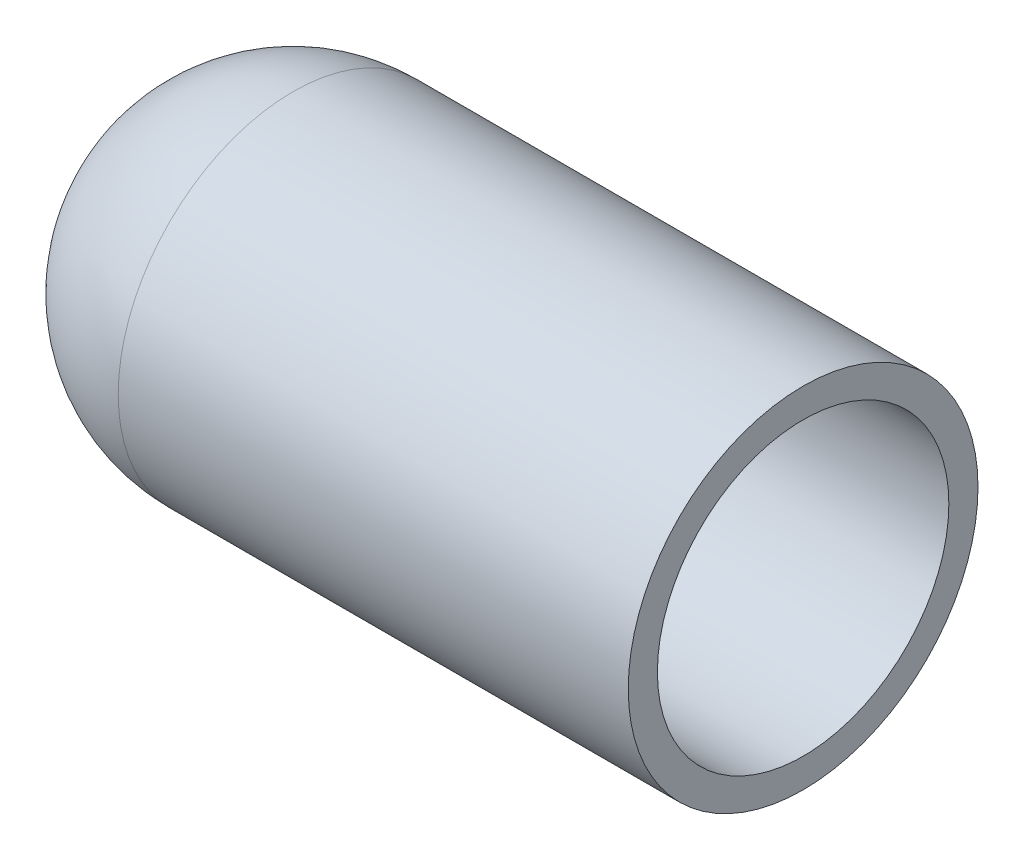
ISO-10303-21;
HEADER;
FILE_DESCRIPTION(('STEP AP214'),'2;1');
FILE_NAME('part.step','',(''),(''),'','','');
FILE_SCHEMA(('AUTOMOTIVE_DESIGN { 1 0 10303 214 1 1 1 1 }'));
ENDSEC;
DATA;
#1=APPLICATION_CONTEXT('core data for automotive mechanical design processes');
#2=APPLICATION_PROTOCOL_DEFINITION('international standard','automotive_design',2000,#1);
#3=PRODUCT_CONTEXT('',#1,'mechanical');
#4=PRODUCT('Part','Part','',(#3));
#5=PRODUCT_RELATED_PRODUCT_CATEGORY('part','',(#4));
#6=PRODUCT_DEFINITION_FORMATION('','',#4);
#7=PRODUCT_DEFINITION_CONTEXT('part definition',#1,'design');
#8=PRODUCT_DEFINITION('design','',#6,#7);
#9=PRODUCT_DEFINITION_SHAPE('','',#8);
#10=(LENGTH_UNIT() NAMED_UNIT(*) SI_UNIT(.MILLI.,.METRE.));
#11=(NAMED_UNIT(*) PLANE_ANGLE_UNIT() SI_UNIT($,.RADIAN.));
#12=(NAMED_UNIT(*) SI_UNIT($,.STERADIAN.) SOLID_ANGLE_UNIT());
#13=UNCERTAINTY_MEASURE_WITH_UNIT(LENGTH_MEASURE(1.E-05),#10,'distance_accuracy_value','');
#14=(GEOMETRIC_REPRESENTATION_CONTEXT(3) GLOBAL_UNCERTAINTY_ASSIGNED_CONTEXT((#13)) GLOBAL_UNIT_ASSIGNED_CONTEXT((#10,
#11,#12)) REPRESENTATION_CONTEXT('',''));
#15=CARTESIAN_POINT('',(0.,0.,0.));
#16=DIRECTION('',(0.,0.,1.));
#17=DIRECTION('',(1.,0.,0.));
#18=AXIS2_PLACEMENT_3D('',#15,#16,#17);
#19=CARTESIAN_POINT('',(18.8400471736981,0.,-12.));
#20=DIRECTION('',(1.,0.,0.));
#21=DIRECTION('',(0.,0.,-1.));
#22=AXIS2_PLACEMENT_3D('',#19,#20,#21);
#23=PLANE('',#22);
#24=CARTESIAN_POINT('',(18.8400471736981,0.,0.));
#25=DIRECTION('',(1.,0.,0.));
#26=DIRECTION('',(0.,0.,-1.));
#27=AXIS2_PLACEMENT_3D('',#24,#25,#26);
#28=CIRCLE('',#27,10.);
#29=CARTESIAN_POINT('',(18.8400471736981,0.,-10.));
#30=VERTEX_POINT('',#29);
#31=EDGE_CURVE('E41',#30,#30,#28,.F.);
#32=ORIENTED_EDGE('',*,*,#31,.T.);
#33=EDGE_LOOP('',(#32));
#34=FACE_BOUND('',#33,.T.);
#35=CARTESIAN_POINT('',(18.8400471736981,0.,0.));
#36=DIRECTION('',(-1.,0.,0.));
#37=DIRECTION('',(0.,0.,1.));
#38=AXIS2_PLACEMENT_3D('',#35,#36,#37);
#39=CIRCLE('',#38,12.);
#40=CARTESIAN_POINT('',(18.8400471736981,0.,12.));
#41=VERTEX_POINT('',#40);
#42=EDGE_CURVE('E10',#41,#41,#39,.T.);
#43=ORIENTED_EDGE('',*,*,#42,.F.);
#44=EDGE_LOOP('',(#43));
#45=FACE_BOUND('',#44,.T.);
#46=ADVANCED_FACE('F31',(#34,#45),#23,.T.);
#47=CARTESIAN_POINT('',(-16.1599528263019,0.,0.));
#48=DIRECTION('',(-1.,0.,0.));
#49=DIRECTION('',(0.,0.,1.));
#50=AXIS2_PLACEMENT_3D('',#47,#48,#49);
#51=CYLINDRICAL_SURFACE('',#50,12.);
#52=ORIENTED_EDGE('',*,*,#42,.T.);
#53=EDGE_LOOP('',(#52));
#54=FACE_BOUND('',#53,.T.);
#55=CARTESIAN_POINT('',(-16.1599528263019,0.,0.));
#56=DIRECTION('',(-1.,0.,0.));
#57=DIRECTION('',(0.,0.,1.));
#58=AXIS2_PLACEMENT_3D('',#55,#56,#57);
#59=CIRCLE('',#58,12.);
#60=CARTESIAN_POINT('',(-16.1599528263019,0.,12.));
#61=VERTEX_POINT('',#60);
#62=EDGE_CURVE('E37',#61,#61,#59,.T.);
#63=ORIENTED_EDGE('',*,*,#62,.F.);
#64=EDGE_LOOP('',(#63));
#65=FACE_BOUND('',#64,.T.);
#66=ADVANCED_FACE('F64',(#54,#65),#51,.T.);
#67=CARTESIAN_POINT('',(-16.1599528263019,0.,0.));
#68=DIRECTION('',(-1.,0.,0.));
#69=DIRECTION('',(0.,0.,-1.));
#70=AXIS2_PLACEMENT_3D('',#67,#68,#69);
#71=SPHERICAL_SURFACE('',#70,12.);
#72=ORIENTED_EDGE('',*,*,#62,.T.);
#73=EDGE_LOOP('',(#72));
#74=FACE_BOUND('',#73,.T.);
#75=ADVANCED_FACE('F59',(#74),#71,.T.);
#76=CARTESIAN_POINT('',(-16.1599528263019,0.,0.));
#77=DIRECTION('',(-1.,0.,0.));
#78=DIRECTION('',(0.,0.,1.));
#79=AXIS2_PLACEMENT_3D('',#76,#77,#78);
#80=CYLINDRICAL_SURFACE('',#79,10.);
#81=ORIENTED_EDGE('',*,*,#31,.F.);
#82=EDGE_LOOP('',(#81));
#83=FACE_BOUND('',#82,.T.);
#84=CARTESIAN_POINT('',(-16.1599528263019,0.,0.));
#85=DIRECTION('',(-1.,0.,0.));
#86=DIRECTION('',(0.,0.,1.));
#87=AXIS2_PLACEMENT_3D('',#84,#85,#86);
#88=CIRCLE('',#87,10.);
#89=CARTESIAN_POINT('',(-16.1599528263019,0.,10.));
#90=VERTEX_POINT('',#89);
#91=EDGE_CURVE('E45',#90,#90,#88,.T.);
#92=ORIENTED_EDGE('',*,*,#91,.T.);
#93=EDGE_LOOP('',(#92));
#94=FACE_BOUND('',#93,.T.);
#95=ADVANCED_FACE('F51',(#83,#94),#80,.F.);
#96=CARTESIAN_POINT('',(-16.1599528263019,0.,0.));
#97=DIRECTION('',(-1.,0.,0.));
#98=DIRECTION('',(0.,0.,-1.));
#99=AXIS2_PLACEMENT_3D('',#96,#97,#98);
#100=SPHERICAL_SURFACE('',#99,10.);
#101=ORIENTED_EDGE('',*,*,#91,.F.);
#102=EDGE_LOOP('',(#101));
#103=FACE_BOUND('',#102,.T.);
#104=ADVANCED_FACE('F53',(#103),#100,.F.);
#105=CLOSED_SHELL('',(#46,#66,#75,#95,#104));
#106=MANIFOLD_SOLID_BREP('B2',#105);
#107=ADVANCED_BREP_SHAPE_REPRESENTATION('',(#18,#106),#14);
#108=SHAPE_DEFINITION_REPRESENTATION(#9,#107);
ENDSEC;
END-ISO-10303-21;
